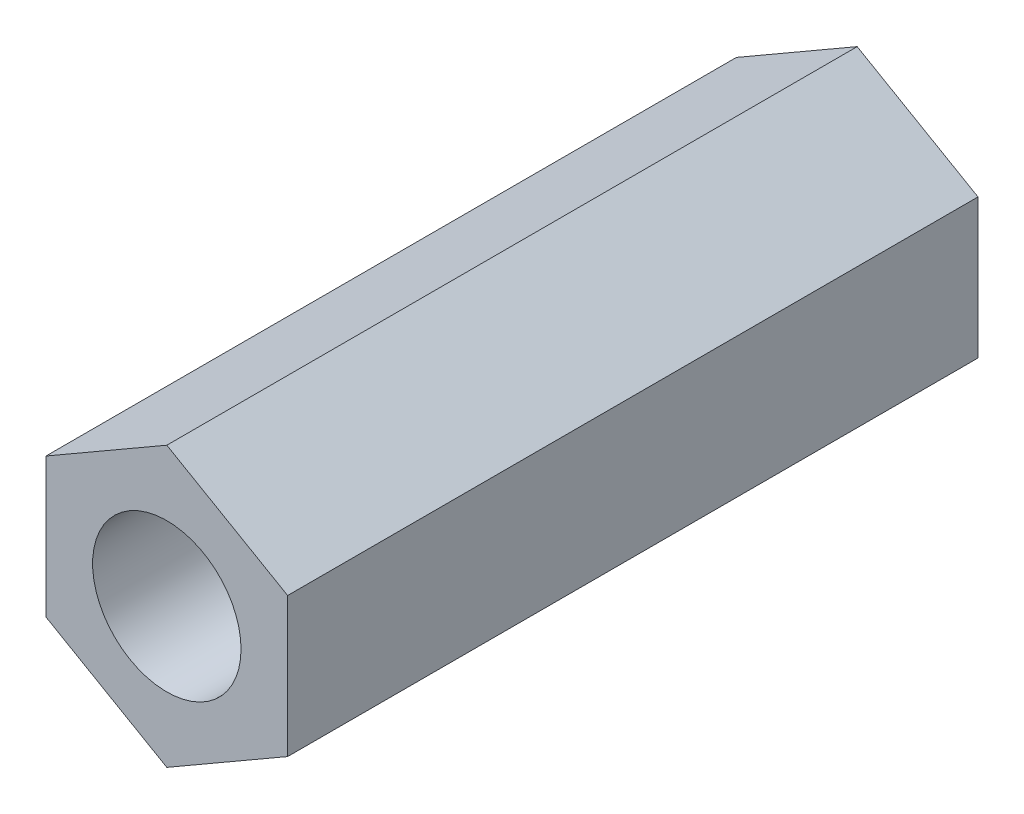
ISO-10303-21;
HEADER;
FILE_DESCRIPTION(('STEP AP214'),'2;1');
FILE_NAME('part.step','',(''),(''),'','','');
FILE_SCHEMA(('AUTOMOTIVE_DESIGN { 1 0 10303 214 1 1 1 1 }'));
ENDSEC;
DATA;
#1=APPLICATION_CONTEXT('core data for automotive mechanical design processes');
#2=APPLICATION_PROTOCOL_DEFINITION('international standard','automotive_design',2000,#1);
#3=PRODUCT_CONTEXT('',#1,'mechanical');
#4=PRODUCT('Part','Part','',(#3));
#5=PRODUCT_RELATED_PRODUCT_CATEGORY('part','',(#4));
#6=PRODUCT_DEFINITION_FORMATION('','',#4);
#7=PRODUCT_DEFINITION_CONTEXT('part definition',#1,'design');
#8=PRODUCT_DEFINITION('design','',#6,#7);
#9=PRODUCT_DEFINITION_SHAPE('','',#8);
#10=(LENGTH_UNIT() NAMED_UNIT(*) SI_UNIT(.MILLI.,.METRE.));
#11=(NAMED_UNIT(*) PLANE_ANGLE_UNIT() SI_UNIT($,.RADIAN.));
#12=(NAMED_UNIT(*) SI_UNIT($,.STERADIAN.) SOLID_ANGLE_UNIT());
#13=UNCERTAINTY_MEASURE_WITH_UNIT(LENGTH_MEASURE(1.E-05),#10,'distance_accuracy_value','');
#14=(GEOMETRIC_REPRESENTATION_CONTEXT(3) GLOBAL_UNCERTAINTY_ASSIGNED_CONTEXT((#13)) GLOBAL_UNIT_ASSIGNED_CONTEXT((#10,
#11,#12)) REPRESENTATION_CONTEXT('',''));
#15=CARTESIAN_POINT('',(0.,0.,0.));
#16=DIRECTION('',(0.,0.,1.));
#17=DIRECTION('',(1.,0.,0.));
#18=AXIS2_PLACEMENT_3D('',#15,#16,#17);
#19=CARTESIAN_POINT('',(0.,0.,20.));
#20=DIRECTION('',(0.,0.,1.));
#21=DIRECTION('',(1.,0.,0.));
#22=AXIS2_PLACEMENT_3D('',#19,#20,#21);
#23=PLANE('',#22);
#24=DIRECTION('',(0.866025403784439,0.5,0.));
#25=VECTOR('',#24,1.);
#26=CARTESIAN_POINT('',(0.,-4.04145188432738,20.));
#27=LINE('',#26,#25);
#28=CARTESIAN_POINT('',(0.,-4.04145188432738,20.));
#29=VERTEX_POINT('',#28);
#30=CARTESIAN_POINT('',(3.5,-2.02072594216369,20.));
#31=VERTEX_POINT('',#30);
#32=EDGE_CURVE('E133',#29,#31,#27,.T.);
#33=ORIENTED_EDGE('',*,*,#32,.T.);
#34=DIRECTION('',(0.,1.,0.));
#35=VECTOR('',#34,1.);
#36=CARTESIAN_POINT('',(3.5,-2.02072594216369,20.));
#37=LINE('',#36,#35);
#38=CARTESIAN_POINT('',(3.5,2.02072594216369,20.));
#39=VERTEX_POINT('',#38);
#40=EDGE_CURVE('E95',#31,#39,#37,.T.);
#41=ORIENTED_EDGE('',*,*,#40,.T.);
#42=DIRECTION('',(-0.866025403784439,0.5,0.));
#43=VECTOR('',#42,1.);
#44=CARTESIAN_POINT('',(3.5,2.02072594216369,20.));
#45=LINE('',#44,#43);
#46=CARTESIAN_POINT('',(0.,4.04145188432738,20.));
#47=VERTEX_POINT('',#46);
#48=EDGE_CURVE('E106',#39,#47,#45,.T.);
#49=ORIENTED_EDGE('',*,*,#48,.T.);
#50=DIRECTION('',(-0.866025403784439,-0.5,0.));
#51=VECTOR('',#50,1.);
#52=CARTESIAN_POINT('',(0.,4.04145188432738,20.));
#53=LINE('',#52,#51);
#54=CARTESIAN_POINT('',(-3.5,2.02072594216369,20.));
#55=VERTEX_POINT('',#54);
#56=EDGE_CURVE('E99',#47,#55,#53,.T.);
#57=ORIENTED_EDGE('',*,*,#56,.T.);
#58=DIRECTION('',(0.,-1.,0.));
#59=VECTOR('',#58,1.);
#60=CARTESIAN_POINT('',(-3.5,2.02072594216369,20.));
#61=LINE('',#60,#59);
#62=CARTESIAN_POINT('',(-3.5,-2.02072594216369,20.));
#63=VERTEX_POINT('',#62);
#64=EDGE_CURVE('E104',#55,#63,#61,.T.);
#65=ORIENTED_EDGE('',*,*,#64,.T.);
#66=DIRECTION('',(0.866025403784438,-0.5,0.));
#67=VECTOR('',#66,1.);
#68=CARTESIAN_POINT('',(-3.5,-2.02072594216369,20.));
#69=LINE('',#68,#67);
#70=EDGE_CURVE('E57',#63,#29,#69,.T.);
#71=ORIENTED_EDGE('',*,*,#70,.T.);
#72=EDGE_LOOP('',(#33,#41,#49,#57,#65,#71));
#73=FACE_BOUND('',#72,.T.);
#74=CARTESIAN_POINT('',(0.,0.,20.));
#75=DIRECTION('',(0.,0.,1.));
#76=DIRECTION('',(1.,0.,0.));
#77=AXIS2_PLACEMENT_3D('',#74,#75,#76);
#78=CIRCLE('',#77,2.15);
#79=CARTESIAN_POINT('',(2.15,0.,20.));
#80=VERTEX_POINT('',#79);
#81=EDGE_CURVE('E127',#80,#80,#78,.T.);
#82=ORIENTED_EDGE('',*,*,#81,.F.);
#83=EDGE_LOOP('',(#82));
#84=FACE_BOUND('',#83,.T.);
#85=ADVANCED_FACE('F39',(#73,#84),#23,.T.);
#86=CARTESIAN_POINT('',(0.,0.,0.));
#87=DIRECTION('',(0.,0.,1.));
#88=DIRECTION('',(1.,0.,0.));
#89=AXIS2_PLACEMENT_3D('',#86,#87,#88);
#90=PLANE('',#89);
#91=DIRECTION('',(0.866025403784439,0.5,0.));
#92=VECTOR('',#91,1.);
#93=CARTESIAN_POINT('',(0.,-4.04145188432738,0.));
#94=LINE('',#93,#92);
#95=CARTESIAN_POINT('',(0.,-4.04145188432738,0.));
#96=VERTEX_POINT('',#95);
#97=CARTESIAN_POINT('',(3.5,-2.02072594216369,0.));
#98=VERTEX_POINT('',#97);
#99=EDGE_CURVE('E121',#96,#98,#94,.T.);
#100=ORIENTED_EDGE('',*,*,#99,.F.);
#101=DIRECTION('',(0.866025403784438,-0.5,0.));
#102=VECTOR('',#101,1.);
#103=CARTESIAN_POINT('',(-3.5,-2.02072594216369,0.));
#104=LINE('',#103,#102);
#105=CARTESIAN_POINT('',(-3.5,-2.02072594216369,0.));
#106=VERTEX_POINT('',#105);
#107=EDGE_CURVE('E84',#106,#96,#104,.T.);
#108=ORIENTED_EDGE('',*,*,#107,.F.);
#109=DIRECTION('',(0.,-1.,0.));
#110=VECTOR('',#109,1.);
#111=CARTESIAN_POINT('',(-3.5,2.02072594216369,0.));
#112=LINE('',#111,#110);
#113=CARTESIAN_POINT('',(-3.5,2.02072594216369,0.));
#114=VERTEX_POINT('',#113);
#115=EDGE_CURVE('E79',#114,#106,#112,.T.);
#116=ORIENTED_EDGE('',*,*,#115,.F.);
#117=DIRECTION('',(-0.866025403784439,-0.5,0.));
#118=VECTOR('',#117,1.);
#119=CARTESIAN_POINT('',(0.,4.04145188432738,0.));
#120=LINE('',#119,#118);
#121=CARTESIAN_POINT('',(0.,4.04145188432738,0.));
#122=VERTEX_POINT('',#121);
#123=EDGE_CURVE('E112',#122,#114,#120,.T.);
#124=ORIENTED_EDGE('',*,*,#123,.F.);
#125=DIRECTION('',(-0.866025403784439,0.5,0.));
#126=VECTOR('',#125,1.);
#127=CARTESIAN_POINT('',(3.5,2.02072594216369,0.));
#128=LINE('',#127,#126);
#129=CARTESIAN_POINT('',(3.5,2.02072594216369,0.));
#130=VERTEX_POINT('',#129);
#131=EDGE_CURVE('E129',#130,#122,#128,.T.);
#132=ORIENTED_EDGE('',*,*,#131,.F.);
#133=DIRECTION('',(0.,1.,0.));
#134=VECTOR('',#133,1.);
#135=CARTESIAN_POINT('',(3.5,-2.02072594216369,0.));
#136=LINE('',#135,#134);
#137=EDGE_CURVE('E130',#98,#130,#136,.T.);
#138=ORIENTED_EDGE('',*,*,#137,.F.);
#139=EDGE_LOOP('',(#100,#108,#116,#124,#132,#138));
#140=FACE_BOUND('',#139,.T.);
#141=CARTESIAN_POINT('',(0.,0.,0.));
#142=DIRECTION('',(0.,0.,1.));
#143=DIRECTION('',(1.,0.,0.));
#144=AXIS2_PLACEMENT_3D('',#141,#142,#143);
#145=CIRCLE('',#144,2.15);
#146=CARTESIAN_POINT('',(2.15,0.,0.));
#147=VERTEX_POINT('',#146);
#148=EDGE_CURVE('E226',#147,#147,#145,.T.);
#149=ORIENTED_EDGE('',*,*,#148,.T.);
#150=EDGE_LOOP('',(#149));
#151=FACE_BOUND('',#150,.T.);
#152=ADVANCED_FACE('F144',(#140,#151),#90,.F.);
#153=CARTESIAN_POINT('',(0.,-4.04145188432738,20.));
#154=DIRECTION('',(-0.5,0.866025403784439,0.));
#155=DIRECTION('',(-0.866025403784439,-0.5,0.));
#156=AXIS2_PLACEMENT_3D('',#153,#154,#155);
#157=PLANE('',#156);
#158=ORIENTED_EDGE('',*,*,#99,.T.);
#159=DIRECTION('',(0.,0.,-1.));
#160=VECTOR('',#159,1.);
#161=CARTESIAN_POINT('',(3.5,-2.02072594216369,20.));
#162=LINE('',#161,#160);
#163=EDGE_CURVE('E11',#31,#98,#162,.T.);
#164=ORIENTED_EDGE('',*,*,#163,.F.);
#165=ORIENTED_EDGE('',*,*,#32,.F.);
#166=DIRECTION('',(0.,0.,-1.));
#167=VECTOR('',#166,1.);
#168=CARTESIAN_POINT('',(0.,-4.04145188432738,20.));
#169=LINE('',#168,#167);
#170=EDGE_CURVE('E119',#29,#96,#169,.T.);
#171=ORIENTED_EDGE('',*,*,#170,.T.);
#172=EDGE_LOOP('',(#158,#164,#165,#171));
#173=FACE_BOUND('',#172,.T.);
#174=ADVANCED_FACE('F41',(#173),#157,.F.);
#175=CARTESIAN_POINT('',(3.5,-2.02072594216369,20.));
#176=DIRECTION('',(-1.,0.,0.));
#177=DIRECTION('',(0.,-1.,0.));
#178=AXIS2_PLACEMENT_3D('',#175,#176,#177);
#179=PLANE('',#178);
#180=ORIENTED_EDGE('',*,*,#137,.T.);
#181=DIRECTION('',(0.,0.,-1.));
#182=VECTOR('',#181,1.);
#183=CARTESIAN_POINT('',(3.5,2.02072594216369,20.));
#184=LINE('',#183,#182);
#185=EDGE_CURVE('E48',#39,#130,#184,.T.);
#186=ORIENTED_EDGE('',*,*,#185,.F.);
#187=ORIENTED_EDGE('',*,*,#40,.F.);
#188=ORIENTED_EDGE('',*,*,#163,.T.);
#189=EDGE_LOOP('',(#180,#186,#187,#188));
#190=FACE_BOUND('',#189,.T.);
#191=ADVANCED_FACE('F169',(#190),#179,.F.);
#192=CARTESIAN_POINT('',(3.5,2.02072594216369,20.));
#193=DIRECTION('',(-0.5,-0.866025403784439,0.));
#194=DIRECTION('',(0.866025403784439,-0.5,0.));
#195=AXIS2_PLACEMENT_3D('',#192,#193,#194);
#196=PLANE('',#195);
#197=ORIENTED_EDGE('',*,*,#131,.T.);
#198=DIRECTION('',(0.,0.,-1.));
#199=VECTOR('',#198,1.);
#200=CARTESIAN_POINT('',(0.,4.04145188432738,20.));
#201=LINE('',#200,#199);
#202=EDGE_CURVE('E114',#47,#122,#201,.T.);
#203=ORIENTED_EDGE('',*,*,#202,.F.);
#204=ORIENTED_EDGE('',*,*,#48,.F.);
#205=ORIENTED_EDGE('',*,*,#185,.T.);
#206=EDGE_LOOP('',(#197,#203,#204,#205));
#207=FACE_BOUND('',#206,.T.);
#208=ADVANCED_FACE('F142',(#207),#196,.F.);
#209=CARTESIAN_POINT('',(0.,4.04145188432738,20.));
#210=DIRECTION('',(0.5,-0.866025403784439,0.));
#211=DIRECTION('',(0.866025403784439,0.5,0.));
#212=AXIS2_PLACEMENT_3D('',#209,#210,#211);
#213=PLANE('',#212);
#214=ORIENTED_EDGE('',*,*,#123,.T.);
#215=DIRECTION('',(0.,0.,-1.));
#216=VECTOR('',#215,1.);
#217=CARTESIAN_POINT('',(-3.5,2.02072594216369,20.));
#218=LINE('',#217,#216);
#219=EDGE_CURVE('E111',#55,#114,#218,.T.);
#220=ORIENTED_EDGE('',*,*,#219,.F.);
#221=ORIENTED_EDGE('',*,*,#56,.F.);
#222=ORIENTED_EDGE('',*,*,#202,.T.);
#223=EDGE_LOOP('',(#214,#220,#221,#222));
#224=FACE_BOUND('',#223,.T.);
#225=ADVANCED_FACE('F115',(#224),#213,.F.);
#226=CARTESIAN_POINT('',(-3.5,2.02072594216369,20.));
#227=DIRECTION('',(1.,0.,0.));
#228=DIRECTION('',(0.,0.,-1.));
#229=AXIS2_PLACEMENT_3D('',#226,#227,#228);
#230=PLANE('',#229);
#231=ORIENTED_EDGE('',*,*,#115,.T.);
#232=DIRECTION('',(0.,0.,-1.));
#233=VECTOR('',#232,1.);
#234=CARTESIAN_POINT('',(-3.5,-2.02072594216369,20.));
#235=LINE('',#234,#233);
#236=EDGE_CURVE('E116',#63,#106,#235,.T.);
#237=ORIENTED_EDGE('',*,*,#236,.F.);
#238=ORIENTED_EDGE('',*,*,#64,.F.);
#239=ORIENTED_EDGE('',*,*,#219,.T.);
#240=EDGE_LOOP('',(#231,#237,#238,#239));
#241=FACE_BOUND('',#240,.T.);
#242=ADVANCED_FACE('F117',(#241),#230,.F.);
#243=CARTESIAN_POINT('',(-3.5,-2.02072594216369,20.));
#244=DIRECTION('',(0.5,0.866025403784438,0.));
#245=DIRECTION('',(-0.866025403784439,0.5,0.));
#246=AXIS2_PLACEMENT_3D('',#243,#244,#245);
#247=PLANE('',#246);
#248=ORIENTED_EDGE('',*,*,#107,.T.);
#249=ORIENTED_EDGE('',*,*,#170,.F.);
#250=ORIENTED_EDGE('',*,*,#70,.F.);
#251=ORIENTED_EDGE('',*,*,#236,.T.);
#252=EDGE_LOOP('',(#248,#249,#250,#251));
#253=FACE_BOUND('',#252,.T.);
#254=ADVANCED_FACE('F148',(#253),#247,.F.);
#255=CARTESIAN_POINT('',(0.,0.,20.));
#256=DIRECTION('',(0.,0.,-1.));
#257=DIRECTION('',(-1.,0.,0.));
#258=AXIS2_PLACEMENT_3D('',#255,#256,#257);
#259=CYLINDRICAL_SURFACE('',#258,2.15);
#260=ORIENTED_EDGE('',*,*,#81,.T.);
#261=EDGE_LOOP('',(#260));
#262=FACE_BOUND('',#261,.T.);
#263=ORIENTED_EDGE('',*,*,#148,.F.);
#264=EDGE_LOOP('',(#263));
#265=FACE_BOUND('',#264,.T.);
#266=ADVANCED_FACE('F152',(#262,#265),#259,.F.);
#267=CLOSED_SHELL('',(#85,#152,#174,#191,#208,#225,#242,#254,#266));
#268=MANIFOLD_SOLID_BREP('B2',#267);
#269=ADVANCED_BREP_SHAPE_REPRESENTATION('',(#18,#268),#14);
#270=SHAPE_DEFINITION_REPRESENTATION(#9,#269);
ENDSEC;
END-ISO-10303-21;
